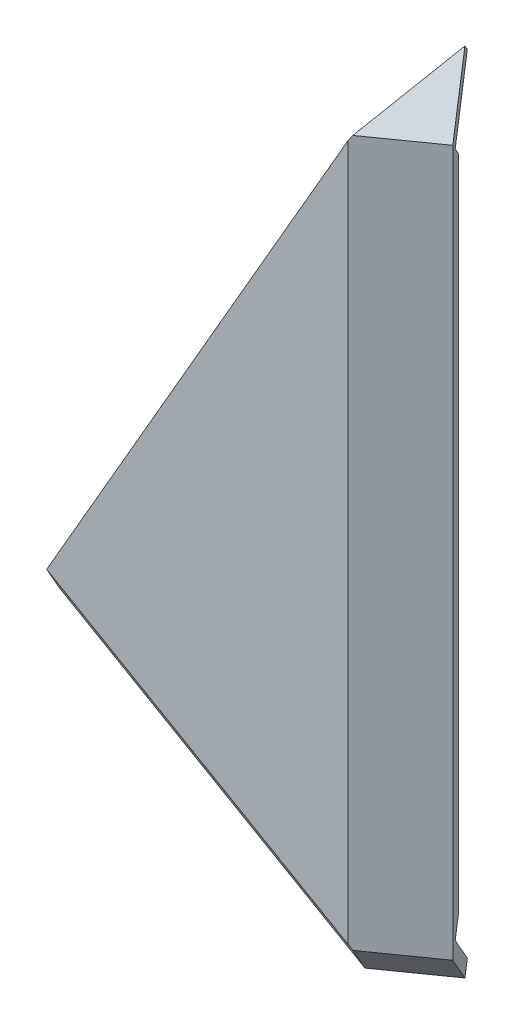
ISO-10303-21;
HEADER;
FILE_DESCRIPTION(('STEP AP214'),'2;1');
FILE_NAME('part.step','',(''),(''),'','','');
FILE_SCHEMA(('AUTOMOTIVE_DESIGN { 1 0 10303 214 1 1 1 1 }'));
ENDSEC;
DATA;
#1=APPLICATION_CONTEXT('core data for automotive mechanical design processes');
#2=APPLICATION_PROTOCOL_DEFINITION('international standard','automotive_design',2000,#1);
#3=PRODUCT_CONTEXT('',#1,'mechanical');
#4=PRODUCT('Part','Part','',(#3));
#5=PRODUCT_RELATED_PRODUCT_CATEGORY('part','',(#4));
#6=PRODUCT_DEFINITION_FORMATION('','',#4);
#7=PRODUCT_DEFINITION_CONTEXT('part definition',#1,'design');
#8=PRODUCT_DEFINITION('design','',#6,#7);
#9=PRODUCT_DEFINITION_SHAPE('','',#8);
#10=(LENGTH_UNIT() NAMED_UNIT(*) SI_UNIT(.MILLI.,.METRE.));
#11=(NAMED_UNIT(*) PLANE_ANGLE_UNIT() SI_UNIT($,.RADIAN.));
#12=(NAMED_UNIT(*) SI_UNIT($,.STERADIAN.) SOLID_ANGLE_UNIT());
#13=UNCERTAINTY_MEASURE_WITH_UNIT(LENGTH_MEASURE(1.E-05),#10,'distance_accuracy_value','');
#14=(GEOMETRIC_REPRESENTATION_CONTEXT(3) GLOBAL_UNCERTAINTY_ASSIGNED_CONTEXT((#13)) GLOBAL_UNIT_ASSIGNED_CONTEXT((#10,
#11,#12)) REPRESENTATION_CONTEXT('',''));
#15=CARTESIAN_POINT('',(0.,0.,0.));
#16=DIRECTION('',(0.,0.,1.));
#17=DIRECTION('',(1.,0.,0.));
#18=AXIS2_PLACEMENT_3D('',#15,#16,#17);
#19=CARTESIAN_POINT('',(178.058961751277,200.921677450415,-11.5470053837999));
#20=DIRECTION('',(0.408248290464223,-0.707106781186351,0.577350269189611));
#21=DIRECTION('',(0.,-0.632455532033772,-0.774596669241405));
#22=AXIS2_PLACEMENT_3D('',#19,#20,#21);
#23=PLANE('',#22);
#24=DIRECTION('',(0.816496580927581,0.,-0.57735026918983));
#25=VECTOR('',#24,1.);
#26=CARTESIAN_POINT('',(161.82808777846,201.093250325706,0.140088666051075));
#27=LINE('',#26,#25);
#28=CARTESIAN_POINT('',(161.828087778472,201.093250325698,0.140088666051072));
#29=VERTEX_POINT('',#28);
#30=CARTESIAN_POINT('',(178.158019397012,201.093250325707,-11.4069167177463));
#31=VERTEX_POINT('',#30);
#32=EDGE_CURVE('E449',#29,#31,#27,.T.);
#33=ORIENTED_EDGE('',*,*,#32,.T.);
#34=DIRECTION('',(0.408248290464021,0.707106781186744,0.577350269189274));
#35=VECTOR('',#34,1.);
#36=CARTESIAN_POINT('',(178.058961751277,200.921677450415,-11.5470053837999));
#37=LINE('',#36,#35);
#38=CARTESIAN_POINT('',(176.017720298958,197.386143544483,-14.4337567297453));
#39=VERTEX_POINT('',#38);
#40=EDGE_CURVE('E192',#39,#31,#37,.T.);
#41=ORIENTED_EDGE('',*,*,#40,.F.);
#42=DIRECTION('',(-0.816496580927468,0.,0.577350269189991));
#43=VECTOR('',#42,1.);
#44=CARTESIAN_POINT('',(176.017720298958,197.386143544483,-14.4337567297453));
#45=LINE('',#44,#43);
#46=CARTESIAN_POINT('',(159.687788680423,197.386143544483,-2.88675134595555));
#47=VERTEX_POINT('',#46);
#48=EDGE_CURVE('E191',#39,#47,#45,.T.);
#49=ORIENTED_EDGE('',*,*,#48,.T.);
#50=DIRECTION('',(0.408248290464021,0.707106781186744,0.577350269189274));
#51=VECTOR('',#50,1.);
#52=CARTESIAN_POINT('',(161.729030132728,200.921677450416,0.));
#53=LINE('',#52,#51);
#54=EDGE_CURVE('E196',#47,#29,#53,.T.);
#55=ORIENTED_EDGE('',*,*,#54,.T.);
#56=EDGE_LOOP('',(#33,#41,#49,#55));
#57=FACE_BOUND('',#56,.T.);
#58=ADVANCED_FACE('F49',(#57),#23,.F.);
#59=CARTESIAN_POINT('',(29.8424114238205,51.6885728064443,42.203542969526));
#60=DIRECTION('',(0.408248290463677,0.707106781186408,0.577350269189928));
#61=DIRECTION('',(0.,-0.632455532033949,0.77459666924126));
#62=AXIS2_PLACEMENT_3D('',#59,#60,#61);
#63=PLANE('',#62);
#64=DIRECTION('',(-0.816496580927562,1.63757896132236E-13,0.577350269189858));
#65=VECTOR('',#64,1.);
#66=CARTESIAN_POINT('',(178.158019397001,9.83127365477043,-11.4069167177568));
#67=LINE('',#66,#65);
#68=CARTESIAN_POINT('',(178.158019397001,9.83127365477043,-11.4069167177568));
#69=VERTEX_POINT('',#68);
#70=CARTESIAN_POINT('',(161.828087778452,9.8312736547737,0.140088666038639));
#71=VERTEX_POINT('',#70);
#72=EDGE_CURVE('E424',#69,#71,#67,.T.);
#73=ORIENTED_EDGE('',*,*,#72,.T.);
#74=DIRECTION('',(0.408248290464025,-0.707106781186689,0.577350269189339));
#75=VECTOR('',#74,1.);
#76=CARTESIAN_POINT('',(161.729030132728,10.0028465300461,0.));
#77=LINE('',#76,#75);
#78=CARTESIAN_POINT('',(159.687788680408,13.538380435978,-2.88675134594544));
#79=VERTEX_POINT('',#78);
#80=EDGE_CURVE('E247',#79,#71,#77,.T.);
#81=ORIENTED_EDGE('',*,*,#80,.F.);
#82=DIRECTION('',(-0.816496580927468,0.,0.577350269189991));
#83=VECTOR('',#82,1.);
#84=CARTESIAN_POINT('',(176.017720298955,13.5383804359777,-14.4337567297433));
#85=LINE('',#84,#83);
#86=CARTESIAN_POINT('',(176.017720298955,13.5383804359777,-14.4337567297433));
#87=VERTEX_POINT('',#86);
#88=EDGE_CURVE('E182',#87,#79,#85,.T.);
#89=ORIENTED_EDGE('',*,*,#88,.F.);
#90=DIRECTION('',(-0.408248290464035,0.707106781186687,-0.577350269189334));
#91=VECTOR('',#90,1.);
#92=CARTESIAN_POINT('',(176.017720298955,13.5383804359777,-14.4337567297433));
#93=LINE('',#92,#91);
#94=EDGE_CURVE('E195',#69,#87,#93,.T.);
#95=ORIENTED_EDGE('',*,*,#94,.F.);
#96=EDGE_LOOP('',(#73,#81,#89,#95));
#97=FACE_BOUND('',#96,.T.);
#98=ADVANCED_FACE('F224',(#97),#63,.F.);
#99=CARTESIAN_POINT('',(153.564064323454,-4.13928909368204,-11.5470053837986));
#100=DIRECTION('',(-0.816496580927738,-4.41400388462299E-13,0.577350269189609));
#101=DIRECTION('',(0.577350269189609,0.,0.816496580927738));
#102=AXIS2_PLACEMENT_3D('',#99,#100,#101);
#103=PLANE('',#102);
#104=DIRECTION('',(-0.40824829046363,-0.707106781186473,-0.577350269189882));
#105=VECTOR('',#104,1.);
#106=CARTESIAN_POINT('',(161.828087778452,9.8312736547737,0.140088666038639));
#107=LINE('',#106,#105);
#108=CARTESIAN_POINT('',(153.663121969179,-4.31086196895558,-11.4069167177589));
#109=VERTEX_POINT('',#108);
#110=EDGE_CURVE('E428',#71,#109,#107,.T.);
#111=ORIENTED_EDGE('',*,*,#110,.T.);
#112=DIRECTION('',(0.408248290464025,-0.707106781186689,0.577350269189339));
#113=VECTOR('',#112,1.);
#114=CARTESIAN_POINT('',(153.564064323454,-4.13928909368204,-11.5470053837986));
#115=LINE('',#114,#113);
#116=CARTESIAN_POINT('',(151.522822871135,-0.603755187750129,-14.433756729744));
#117=VERTEX_POINT('',#116);
#118=EDGE_CURVE('E187',#117,#109,#115,.T.);
#119=ORIENTED_EDGE('',*,*,#118,.F.);
#120=DIRECTION('',(0.408248290463677,0.707106781186408,0.577350269189928));
#121=VECTOR('',#120,1.);
#122=CARTESIAN_POINT('',(151.522822871135,-0.603755187750129,-14.433756729744));
#123=LINE('',#122,#121);
#124=EDGE_CURVE('E184',#117,#79,#123,.T.);
#125=ORIENTED_EDGE('',*,*,#124,.T.);
#126=ORIENTED_EDGE('',*,*,#80,.T.);
#127=EDGE_LOOP('',(#111,#119,#125,#126));
#128=FACE_BOUND('',#127,.T.);
#129=ADVANCED_FACE('F216',(#128),#103,.F.);
#130=CARTESIAN_POINT('',(0.,0.,-2.88675134594544));
#131=DIRECTION('',(0.,0.,-1.));
#132=DIRECTION('',(-1.,0.,0.));
#133=AXIS2_PLACEMENT_3D('',#130,#131,#132);
#134=PLANE('',#133);
#135=DIRECTION('',(-0.500000000000023,-0.866025403784426,0.));
#136=VECTOR('',#135,1.);
#137=CARTESIAN_POINT('',(34.2951341780289,-19.8003049495805,-2.88675134594544));
#138=LINE('',#137,#136);
#139=CARTESIAN_POINT('',(80.0793720399579,59.5003212130945,-2.88675134595072));
#140=VERTEX_POINT('',#139);
#141=EDGE_CURVE('E459',#47,#140,#138,.T.);
#142=ORIENTED_EDGE('',*,*,#141,.F.);
#143=DIRECTION('',(0.,1.,0.));
#144=VECTOR('',#143,1.);
#145=CARTESIAN_POINT('',(159.687788680409,197.386143544483,-2.88675134594544));
#146=LINE('',#145,#144);
#147=EDGE_CURVE('E172',#79,#47,#146,.T.);
#148=ORIENTED_EDGE('',*,*,#147,.F.);
#149=DIRECTION('',(0.866025403784434,-0.500000000000009,0.));
#150=VECTOR('',#149,1.);
#151=CARTESIAN_POINT('',(159.687788680408,13.538380435978,-2.88675134594544));
#152=LINE('',#151,#150);
#153=EDGE_CURVE('E53',#140,#79,#152,.T.);
#154=ORIENTED_EDGE('',*,*,#153,.F.);
#155=EDGE_LOOP('',(#142,#148,#154));
#156=FACE_BOUND('',#155,.T.);
#157=ADVANCED_FACE('F273',(#156),#134,.T.);
#158=CARTESIAN_POINT('',(0.,0.,3.));
#159=DIRECTION('',(0.,0.,-1.));
#160=DIRECTION('',(-1.,0.,0.));
#161=AXIS2_PLACEMENT_3D('',#158,#159,#160);
#162=PLANE('',#161);
#163=DIRECTION('',(0.,1.,0.));
#164=VECTOR('',#163,1.);
#165=CARTESIAN_POINT('',(162.682541868316,-2.90853924134329E-13,3.));
#166=LINE('',#165,#164);
#167=CARTESIAN_POINT('',(162.682541868316,8.35131575839451,3.));
#168=VERTEX_POINT('',#167);
#169=CARTESIAN_POINT('',(162.682541868316,202.573208222043,3.));
#170=VERTEX_POINT('',#169);
#171=EDGE_CURVE('E166',#168,#170,#166,.T.);
#172=ORIENTED_EDGE('',*,*,#171,.T.);
#173=DIRECTION('',(0.500000000000023,0.866025403784426,0.));
#174=VECTOR('',#173,1.);
#175=CARTESIAN_POINT('',(171.626046749607,218.063813074178,3.));
#176=LINE('',#175,#174);
#177=CARTESIAN_POINT('',(78.5819954460082,56.9067888743095,3.));
#178=VERTEX_POINT('',#177);
#179=EDGE_CURVE('E152',#178,#170,#176,.T.);
#180=ORIENTED_EDGE('',*,*,#179,.F.);
#181=DIRECTION('',(0.866025403784433,-0.500000000000009,0.));
#182=VECTOR('',#181,1.);
#183=CARTESIAN_POINT('',(44.2868612679779,76.7070938238901,3.));
#184=LINE('',#183,#182);
#185=EDGE_CURVE('E163',#178,#168,#184,.T.);
#186=ORIENTED_EDGE('',*,*,#185,.T.);
#187=EDGE_LOOP('',(#172,#180,#186));
#188=FACE_BOUND('',#187,.T.);
#189=ADVANCED_FACE('F51',(#188),#162,.F.);
#190=CARTESIAN_POINT('',(179.791012558844,10.0028465300458,-9.09751564101553));
#191=DIRECTION('',(-0.577350269189991,0.,-0.816496580927468));
#192=DIRECTION('',(-0.816496580927468,0.,0.577350269189991));
#193=AXIS2_PLACEMENT_3D('',#190,#191,#192);
#194=PLANE('',#193);
#195=ORIENTED_EDGE('',*,*,#171,.F.);
#196=DIRECTION('',(0.471404520790943,-0.816496580927673,-0.333333333333588));
#197=VECTOR('',#196,1.);
#198=CARTESIAN_POINT('',(167.749690941435,-0.425243885774727,-0.583015470889195));
#199=LINE('',#198,#197);
#200=CARTESIAN_POINT('',(163.461080940307,7.00284653002721,2.4494897427967));
#201=VERTEX_POINT('',#200);
#202=EDGE_CURVE('E171',#168,#201,#199,.T.);
#203=ORIENTED_EDGE('',*,*,#202,.T.);
#204=DIRECTION('',(-0.816496580927468,-9.08875775284897E-13,0.577350269189991));
#205=VECTOR('',#204,1.);
#206=CARTESIAN_POINT('',(55.6417275185422,7.00284652992497,78.689285690527));
#207=LINE('',#206,#205);
#208=CARTESIAN_POINT('',(179.791012558856,7.00284653002393,-9.0975156409987));
#209=VERTEX_POINT('',#208);
#210=EDGE_CURVE('E175',#209,#201,#207,.T.);
#211=ORIENTED_EDGE('',*,*,#210,.F.);
#212=DIRECTION('',(0.,-1.,0.));
#213=VECTOR('',#212,1.);
#214=CARTESIAN_POINT('',(179.791012558844,-3.02113222563973E-12,-9.09751564101539));
#215=LINE('',#214,#213);
#216=CARTESIAN_POINT('',(179.791012558847,203.921677450417,-9.09751564101752));
#217=VERTEX_POINT('',#216);
#218=EDGE_CURVE('E193',#217,#209,#215,.T.);
#219=ORIENTED_EDGE('',*,*,#218,.F.);
#220=DIRECTION('',(-0.816496580927468,0.,0.577350269189991));
#221=VECTOR('',#220,1.);
#222=CARTESIAN_POINT('',(179.791012558847,203.921677450417,-9.09751564101752));
#223=LINE('',#222,#221);
#224=CARTESIAN_POINT('',(163.461080940316,203.921677450452,2.44948974280926));
#225=VERTEX_POINT('',#224);
#226=EDGE_CURVE('E188',#217,#225,#223,.T.);
#227=ORIENTED_EDGE('',*,*,#226,.T.);
#228=DIRECTION('',(0.47140452079078,0.816496580927816,-0.33333333333347));
#229=VECTOR('',#228,1.);
#230=CARTESIAN_POINT('',(49.0318062200292,5.72435976153241,83.3632058638193));
#231=LINE('',#230,#229);
#232=EDGE_CURVE('E60',#170,#225,#231,.T.);
#233=ORIENTED_EDGE('',*,*,#232,.F.);
#234=EDGE_LOOP('',(#195,#203,#211,#219,#227,#233));
#235=FACE_BOUND('',#234,.T.);
#236=ADVANCED_FACE('F229',(#235),#194,.F.);
#237=CARTESIAN_POINT('',(176.017720298958,197.386143544483,-14.4337567297453));
#238=DIRECTION('',(0.577350269189991,0.,0.816496580927468));
#239=DIRECTION('',(0.816496580927468,0.,-0.577350269189991));
#240=AXIS2_PLACEMENT_3D('',#237,#238,#239);
#241=PLANE('',#240);
#242=ORIENTED_EDGE('',*,*,#147,.T.);
#243=ORIENTED_EDGE('',*,*,#48,.F.);
#244=DIRECTION('',(0.,1.,0.));
#245=VECTOR('',#244,1.);
#246=CARTESIAN_POINT('',(176.017720298958,197.386143544483,-14.4337567297453));
#247=LINE('',#246,#245);
#248=EDGE_CURVE('E439',#87,#39,#247,.T.);
#249=ORIENTED_EDGE('',*,*,#248,.F.);
#250=ORIENTED_EDGE('',*,*,#88,.T.);
#251=EDGE_LOOP('',(#242,#243,#249,#250));
#252=FACE_BOUND('',#251,.T.);
#253=ADVANCED_FACE('F220',(#252),#241,.F.);
#254=CARTESIAN_POINT('',(124.149285040296,-2.92165249899836E-12,-87.7868013315389));
#255=DIRECTION('',(-0.816496580927466,0.,0.577350269189994));
#256=DIRECTION('',(0.577350269189994,0.,0.816496580927466));
#257=AXIS2_PLACEMENT_3D('',#254,#255,#256);
#258=PLANE('',#257);
#259=ORIENTED_EDGE('',*,*,#218,.T.);
#260=DIRECTION('',(0.408248290463695,0.707106781186473,0.577350269189836));
#261=VECTOR('',#260,1.);
#262=CARTESIAN_POINT('',(171.626046749584,-7.13928909370185,-20.6445210247924));
#263=LINE('',#262,#261);
#264=CARTESIAN_POINT('',(171.626046749584,-7.13928909370185,-20.6445210247924));
#265=VERTEX_POINT('',#264);
#266=EDGE_CURVE('E429',#265,#209,#263,.T.);
#267=ORIENTED_EDGE('',*,*,#266,.F.);
#268=DIRECTION('',(0.40824829046389,-0.707106781186623,0.577350269189515));
#269=VECTOR('',#268,1.);
#270=CARTESIAN_POINT('',(169.993053587729,-4.31086196895535,-22.9539221015505));
#271=LINE('',#270,#269);
#272=CARTESIAN_POINT('',(169.993053587729,-4.31086196895535,-22.9539221015505));
#273=VERTEX_POINT('',#272);
#274=EDGE_CURVE('E250',#273,#265,#271,.T.);
#275=ORIENTED_EDGE('',*,*,#274,.F.);
#276=DIRECTION('',(0.408248290463695,0.707106781186473,0.577350269189836));
#277=VECTOR('',#276,1.);
#278=CARTESIAN_POINT('',(169.993053587729,-4.31086196895535,-22.9539221015505));
#279=LINE('',#278,#277);
#280=EDGE_CURVE('E466',#273,#69,#279,.T.);
#281=ORIENTED_EDGE('',*,*,#280,.T.);
#282=ORIENTED_EDGE('',*,*,#94,.T.);
#283=ORIENTED_EDGE('',*,*,#248,.T.);
#284=ORIENTED_EDGE('',*,*,#40,.T.);
#285=DIRECTION('',(-0.408248290463212,0.70710678118654,-0.577350269190096));
#286=VECTOR('',#285,1.);
#287=CARTESIAN_POINT('',(178.158019397012,201.093250325707,-11.4069167177463));
#288=LINE('',#287,#286);
#289=CARTESIAN_POINT('',(169.993053587718,215.235385949375,-22.9539221015505));
#290=VERTEX_POINT('',#289);
#291=EDGE_CURVE('E447',#31,#290,#288,.T.);
#292=ORIENTED_EDGE('',*,*,#291,.T.);
#293=DIRECTION('',(0.408248290463962,0.707106781186556,0.577350269189546));
#294=VECTOR('',#293,1.);
#295=CARTESIAN_POINT('',(169.993053587751,215.235385949432,-22.9539221015437));
#296=LINE('',#295,#294);
#297=CARTESIAN_POINT('',(171.626046749607,218.063813074178,-20.6445210247855));
#298=VERTEX_POINT('',#297);
#299=EDGE_CURVE('E458',#290,#298,#296,.T.);
#300=ORIENTED_EDGE('',*,*,#299,.T.);
#301=DIRECTION('',(-0.408248290463212,0.70710678118654,-0.577350269190096));
#302=VECTOR('',#301,1.);
#303=CARTESIAN_POINT('',(179.791012558868,203.921677450453,-9.09751564098812));
#304=LINE('',#303,#302);
#305=EDGE_CURVE('E454',#217,#298,#304,.T.);
#306=ORIENTED_EDGE('',*,*,#305,.F.);
#307=EDGE_LOOP('',(#259,#267,#275,#281,#282,#283,#284,#292,#300,#306));
#308=FACE_BOUND('',#307,.T.);
#309=ADVANCED_FACE('F215',(#308),#258,.F.);
#310=CARTESIAN_POINT('',(151.522822871135,-0.603755187750129,-14.433756729744));
#311=DIRECTION('',(-0.288675134594969,-0.500000000000259,0.816496580927512));
#312=DIRECTION('',(0.,-0.85280286542226,-0.52223296786739));
#313=AXIS2_PLACEMENT_3D('',#310,#311,#312);
#314=PLANE('',#313);
#315=DIRECTION('',(0.866025403784474,-0.499999999999938,0.));
#316=VECTOR('',#315,1.);
#317=CARTESIAN_POINT('',(151.522822871135,-0.603755187750129,-14.433756729744));
#318=LINE('',#317,#316);
#319=CARTESIAN_POINT('',(71.9144062306824,45.3581855893674,-14.4337567297493));
#320=VERTEX_POINT('',#319);
#321=EDGE_CURVE('E94',#320,#117,#318,.T.);
#322=ORIENTED_EDGE('',*,*,#321,.F.);
#323=DIRECTION('',(0.408248290463775,0.707106781186352,0.577350269189928));
#324=VECTOR('',#323,1.);
#325=CARTESIAN_POINT('',(71.9144062306866,45.3581855893748,-14.4337567297433));
#326=LINE('',#325,#324);
#327=EDGE_CURVE('E159',#320,#140,#326,.T.);
#328=ORIENTED_EDGE('',*,*,#327,.T.);
#329=ORIENTED_EDGE('',*,*,#153,.T.);
#330=ORIENTED_EDGE('',*,*,#124,.F.);
#331=EDGE_LOOP('',(#322,#328,#329,#330));
#332=FACE_BOUND('',#331,.T.);
#333=ADVANCED_FACE('F205',(#332),#314,.F.);
#334=CARTESIAN_POINT('',(-12.6425187182001,89.8201263664881,-9.09751564102702));
#335=DIRECTION('',(0.288675134594969,0.500000000000259,-0.816496580927512));
#336=DIRECTION('',(0.,0.85280286542226,0.52223296786739));
#337=AXIS2_PLACEMENT_3D('',#334,#335,#336);
#338=PLANE('',#337);
#339=ORIENTED_EDGE('',*,*,#185,.F.);
#340=DIRECTION('',(-0.408248290463775,-0.707106781186352,-0.577350269189928));
#341=VECTOR('',#340,1.);
#342=CARTESIAN_POINT('',(70.0277601007336,42.0904186363931,-9.09751564102773));
#343=LINE('',#342,#341);
#344=CARTESIAN_POINT('',(70.0277601007389,42.0904186364022,-9.09751564103452));
#345=VERTEX_POINT('',#344);
#346=EDGE_CURVE('E149',#178,#345,#343,.T.);
#347=ORIENTED_EDGE('',*,*,#346,.T.);
#348=DIRECTION('',(-0.866025403784474,0.499999999999938,0.));
#349=VECTOR('',#348,1.);
#350=CARTESIAN_POINT('',(35.7326259227016,61.8907235859811,-9.0975156410238));
#351=LINE('',#350,#349);
#352=CARTESIAN_POINT('',(155.296115131024,-7.13928909368356,-9.09751564101586));
#353=VERTEX_POINT('',#352);
#354=EDGE_CURVE('E185',#353,#345,#351,.T.);
#355=ORIENTED_EDGE('',*,*,#354,.F.);
#356=DIRECTION('',(0.408248290463677,0.707106781186408,0.577350269189928));
#357=VECTOR('',#356,1.);
#358=CARTESIAN_POINT('',(155.296115131024,-7.13928909368358,-9.09751564101586));
#359=LINE('',#358,#357);
#360=EDGE_CURVE('E84',#353,#201,#359,.T.);
#361=ORIENTED_EDGE('',*,*,#360,.T.);
#362=ORIENTED_EDGE('',*,*,#202,.F.);
#363=EDGE_LOOP('',(#339,#347,#355,#361,#362));
#364=FACE_BOUND('',#363,.T.);
#365=ADVANCED_FACE('F169',(#364),#338,.F.);
#366=CARTESIAN_POINT('',(21.677445614547,37.5464371827162,30.6565375857275));
#367=DIRECTION('',(0.408248290463677,0.707106781186408,0.577350269189928));
#368=DIRECTION('',(0.,-0.632455532033949,0.77459666924126));
#369=AXIS2_PLACEMENT_3D('',#366,#367,#368);
#370=PLANE('',#369);
#371=ORIENTED_EDGE('',*,*,#354,.T.);
#372=DIRECTION('',(0.288675134594977,0.500000000000254,-0.816496580927512));
#373=VECTOR('',#372,1.);
#374=CARTESIAN_POINT('',(55.9725797925828,17.7461322331359,30.65653758573));
#375=LINE('',#374,#373);
#376=EDGE_CURVE('E154',#345,#320,#375,.T.);
#377=ORIENTED_EDGE('',*,*,#376,.T.);
#378=ORIENTED_EDGE('',*,*,#321,.T.);
#379=ORIENTED_EDGE('',*,*,#118,.T.);
#380=DIRECTION('',(0.816496580927663,0.,-0.577350269189715));
#381=VECTOR('',#380,1.);
#382=CARTESIAN_POINT('',(153.663121969179,-4.31086196895558,-11.4069167177589));
#383=LINE('',#382,#381);
#384=EDGE_CURVE('E432',#109,#273,#383,.T.);
#385=ORIENTED_EDGE('',*,*,#384,.T.);
#386=ORIENTED_EDGE('',*,*,#274,.T.);
#387=DIRECTION('',(0.816496580927663,0.,-0.577350269189715));
#388=VECTOR('',#387,1.);
#389=CARTESIAN_POINT('',(155.296115131035,-7.13928909370207,-9.0975156410008));
#390=LINE('',#389,#388);
#391=EDGE_CURVE('E461',#353,#265,#390,.T.);
#392=ORIENTED_EDGE('',*,*,#391,.F.);
#393=EDGE_LOOP('',(#371,#377,#378,#379,#385,#386,#392));
#394=FACE_BOUND('',#393,.T.);
#395=ADVANCED_FACE('F287',(#394),#370,.F.);
#396=CARTESIAN_POINT('',(24.1663229327892,-41.8572991517095,34.1763416442297));
#397=DIRECTION('',(0.40824829046389,-0.707106781186623,0.577350269189515));
#398=DIRECTION('',(0.,-0.632455532033563,-0.774596669241576));
#399=AXIS2_PLACEMENT_3D('',#396,#397,#398);
#400=PLANE('',#399);
#401=ORIENTED_EDGE('',*,*,#72,.F.);
#402=ORIENTED_EDGE('',*,*,#280,.F.);
#403=ORIENTED_EDGE('',*,*,#384,.F.);
#404=ORIENTED_EDGE('',*,*,#110,.F.);
#405=EDGE_LOOP('',(#401,#402,#403,#404));
#406=FACE_BOUND('',#405,.T.);
#407=ADVANCED_FACE('F291',(#406),#400,.F.);
#408=CARTESIAN_POINT('',(25.7993160946448,-44.685726276456,36.4857427209877));
#409=DIRECTION('',(0.40824829046389,-0.707106781186623,0.577350269189515));
#410=DIRECTION('',(0.,-0.632455532033563,-0.774596669241576));
#411=AXIS2_PLACEMENT_3D('',#408,#409,#410);
#412=PLANE('',#411);
#413=ORIENTED_EDGE('',*,*,#210,.T.);
#414=ORIENTED_EDGE('',*,*,#360,.F.);
#415=ORIENTED_EDGE('',*,*,#391,.T.);
#416=ORIENTED_EDGE('',*,*,#266,.T.);
#417=EDGE_LOOP('',(#413,#414,#415,#416));
#418=FACE_BOUND('',#417,.T.);
#419=ADVANCED_FACE('F296',(#418),#412,.T.);
#420=CARTESIAN_POINT('',(85.05498828223,147.319561141963,120.285917976169));
#421=DIRECTION('',(0.408248290463963,0.707106781186555,0.577350269189547));
#422=DIRECTION('',(0.,-0.63245553203362,0.774596669241529));
#423=AXIS2_PLACEMENT_3D('',#420,#421,#422);
#424=PLANE('',#423);
#425=ORIENTED_EDGE('',*,*,#32,.F.);
#426=DIRECTION('',(0.288675134594786,0.499999999999924,-0.816496580927782));
#427=VECTOR('',#426,1.);
#428=CARTESIAN_POINT('',(119.350122460247,127.519256192388,120.285917976167));
#429=LINE('',#428,#427);
#430=EDGE_CURVE('E167',#29,#290,#429,.T.);
#431=ORIENTED_EDGE('',*,*,#430,.T.);
#432=ORIENTED_EDGE('',*,*,#291,.F.);
#433=EDGE_LOOP('',(#425,#431,#432));
#434=FACE_BOUND('',#433,.T.);
#435=ADVANCED_FACE('F301',(#434),#424,.F.);
#436=CARTESIAN_POINT('',(86.6879814440859,150.14798826671,122.595319052927));
#437=DIRECTION('',(0.408248290463963,0.707106781186555,0.577350269189547));
#438=DIRECTION('',(0.,-0.63245553203362,0.774596669241529));
#439=AXIS2_PLACEMENT_3D('',#436,#437,#438);
#440=PLANE('',#439);
#441=DIRECTION('',(0.288675134594786,0.499999999999924,-0.816496580927782));
#442=VECTOR('',#441,1.);
#443=CARTESIAN_POINT('',(120.983115622102,130.347683317134,122.595319052925));
#444=LINE('',#443,#442);
#445=EDGE_CURVE('E13',#225,#298,#444,.T.);
#446=ORIENTED_EDGE('',*,*,#445,.F.);
#447=ORIENTED_EDGE('',*,*,#226,.F.);
#448=ORIENTED_EDGE('',*,*,#305,.T.);
#449=EDGE_LOOP('',(#446,#447,#448));
#450=FACE_BOUND('',#449,.T.);
#451=ADVANCED_FACE('F303',(#450),#440,.T.);
#452=CARTESIAN_POINT('',(171.626046749607,218.063813074178,-49.));
#453=DIRECTION('',(0.866025403784426,-0.500000000000023,0.));
#454=DIRECTION('',(0.500000000000023,0.866025403784426,0.));
#455=AXIS2_PLACEMENT_3D('',#452,#453,#454);
#456=PLANE('',#455);
#457=ORIENTED_EDGE('',*,*,#141,.T.);
#458=ORIENTED_EDGE('',*,*,#327,.F.);
#459=ORIENTED_EDGE('',*,*,#376,.F.);
#460=ORIENTED_EDGE('',*,*,#346,.F.);
#461=ORIENTED_EDGE('',*,*,#179,.T.);
#462=ORIENTED_EDGE('',*,*,#232,.T.);
#463=ORIENTED_EDGE('',*,*,#445,.T.);
#464=ORIENTED_EDGE('',*,*,#299,.F.);
#465=ORIENTED_EDGE('',*,*,#430,.F.);
#466=ORIENTED_EDGE('',*,*,#54,.F.);
#467=EDGE_LOOP('',(#457,#458,#459,#460,#461,#462,#463,#464,#465,#466));
#468=FACE_BOUND('',#467,.T.);
#469=ADVANCED_FACE('F151',(#468),#456,.F.);
#470=CLOSED_SHELL('',(#58,#98,#129,#157,#189,#236,#253,#309,#333,#365,#395,#407,#419,#435,#451,#469));
#471=MANIFOLD_SOLID_BREP('B2',#470);
#472=ADVANCED_BREP_SHAPE_REPRESENTATION('',(#18,#471),#14);
#473=SHAPE_DEFINITION_REPRESENTATION(#9,#472);
ENDSEC;
END-ISO-10303-21;
